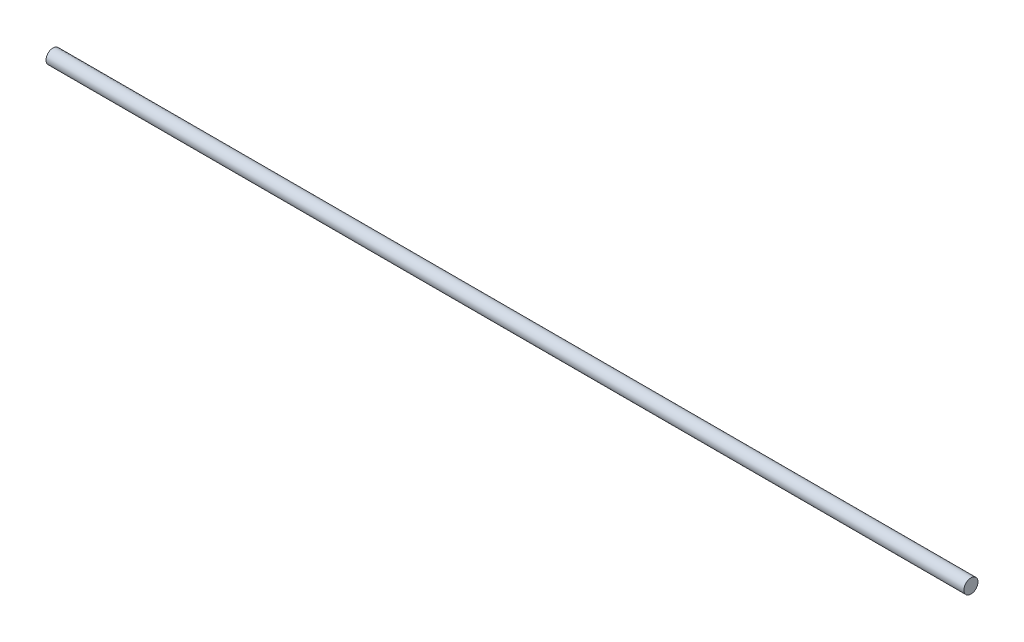
ISO-10303-21;
HEADER;
FILE_DESCRIPTION(('STEP AP214'),'2;1');
FILE_NAME('part.step','',(''),(''),'','','');
FILE_SCHEMA(('AUTOMOTIVE_DESIGN { 1 0 10303 214 1 1 1 1 }'));
ENDSEC;
DATA;
#1=APPLICATION_CONTEXT('core data for automotive mechanical design processes');
#2=APPLICATION_PROTOCOL_DEFINITION('international standard','automotive_design',2000,#1);
#3=PRODUCT_CONTEXT('',#1,'mechanical');
#4=PRODUCT('Part','Part','',(#3));
#5=PRODUCT_RELATED_PRODUCT_CATEGORY('part','',(#4));
#6=PRODUCT_DEFINITION_FORMATION('','',#4);
#7=PRODUCT_DEFINITION_CONTEXT('part definition',#1,'design');
#8=PRODUCT_DEFINITION('design','',#6,#7);
#9=PRODUCT_DEFINITION_SHAPE('','',#8);
#10=(LENGTH_UNIT() NAMED_UNIT(*) SI_UNIT(.MILLI.,.METRE.));
#11=(NAMED_UNIT(*) PLANE_ANGLE_UNIT() SI_UNIT($,.RADIAN.));
#12=(NAMED_UNIT(*) SI_UNIT($,.STERADIAN.) SOLID_ANGLE_UNIT());
#13=UNCERTAINTY_MEASURE_WITH_UNIT(LENGTH_MEASURE(1.E-05),#10,'distance_accuracy_value','');
#14=(GEOMETRIC_REPRESENTATION_CONTEXT(3) GLOBAL_UNCERTAINTY_ASSIGNED_CONTEXT((#13)) GLOBAL_UNIT_ASSIGNED_CONTEXT((#10,
#11,#12)) REPRESENTATION_CONTEXT('',''));
#15=CARTESIAN_POINT('',(0.,0.,0.));
#16=DIRECTION('',(0.,0.,1.));
#17=DIRECTION('',(1.,0.,0.));
#18=AXIS2_PLACEMENT_3D('',#15,#16,#17);
#19=CARTESIAN_POINT('',(130.,0.,0.));
#20=DIRECTION('',(-1.,0.,0.));
#21=DIRECTION('',(0.,0.,1.));
#22=AXIS2_PLACEMENT_3D('',#19,#20,#21);
#23=CYLINDRICAL_SURFACE('',#22,1.);
#24=CARTESIAN_POINT('',(130.,0.,0.));
#25=DIRECTION('',(1.,0.,0.));
#26=DIRECTION('',(0.,0.,-1.));
#27=AXIS2_PLACEMENT_3D('',#24,#25,#26);
#28=CIRCLE('',#27,1.);
#29=CARTESIAN_POINT('',(130.,0.,-1.));
#30=VERTEX_POINT('',#29);
#31=EDGE_CURVE('E10',#30,#30,#28,.T.);
#32=ORIENTED_EDGE('',*,*,#31,.F.);
#33=EDGE_LOOP('',(#32));
#34=FACE_BOUND('',#33,.T.);
#35=CARTESIAN_POINT('',(0.,0.,0.));
#36=DIRECTION('',(1.,0.,0.));
#37=DIRECTION('',(0.,0.,-1.));
#38=AXIS2_PLACEMENT_3D('',#35,#36,#37);
#39=CIRCLE('',#38,1.);
#40=CARTESIAN_POINT('',(0.,0.,-1.));
#41=VERTEX_POINT('',#40);
#42=EDGE_CURVE('E36',#41,#41,#39,.T.);
#43=ORIENTED_EDGE('',*,*,#42,.T.);
#44=EDGE_LOOP('',(#43));
#45=FACE_BOUND('',#44,.T.);
#46=ADVANCED_FACE('F33',(#34,#45),#23,.T.);
#47=CARTESIAN_POINT('',(130.,0.,0.));
#48=DIRECTION('',(1.,0.,0.));
#49=DIRECTION('',(0.,0.,-1.));
#50=AXIS2_PLACEMENT_3D('',#47,#48,#49);
#51=PLANE('',#50);
#52=ORIENTED_EDGE('',*,*,#31,.T.);
#53=EDGE_LOOP('',(#52));
#54=FACE_BOUND('',#53,.T.);
#55=ADVANCED_FACE('F48',(#54),#51,.T.);
#56=CARTESIAN_POINT('',(0.,0.,0.));
#57=DIRECTION('',(1.,0.,0.));
#58=DIRECTION('',(0.,0.,-1.));
#59=AXIS2_PLACEMENT_3D('',#56,#57,#58);
#60=PLANE('',#59);
#61=ORIENTED_EDGE('',*,*,#42,.F.);
#62=EDGE_LOOP('',(#61));
#63=FACE_BOUND('',#62,.T.);
#64=ADVANCED_FACE('F46',(#63),#60,.F.);
#65=CLOSED_SHELL('',(#46,#55,#64));
#66=MANIFOLD_SOLID_BREP('B2',#65);
#67=ADVANCED_BREP_SHAPE_REPRESENTATION('',(#18,#66),#14);
#68=SHAPE_DEFINITION_REPRESENTATION(#9,#67);
ENDSEC;
END-ISO-10303-21;
